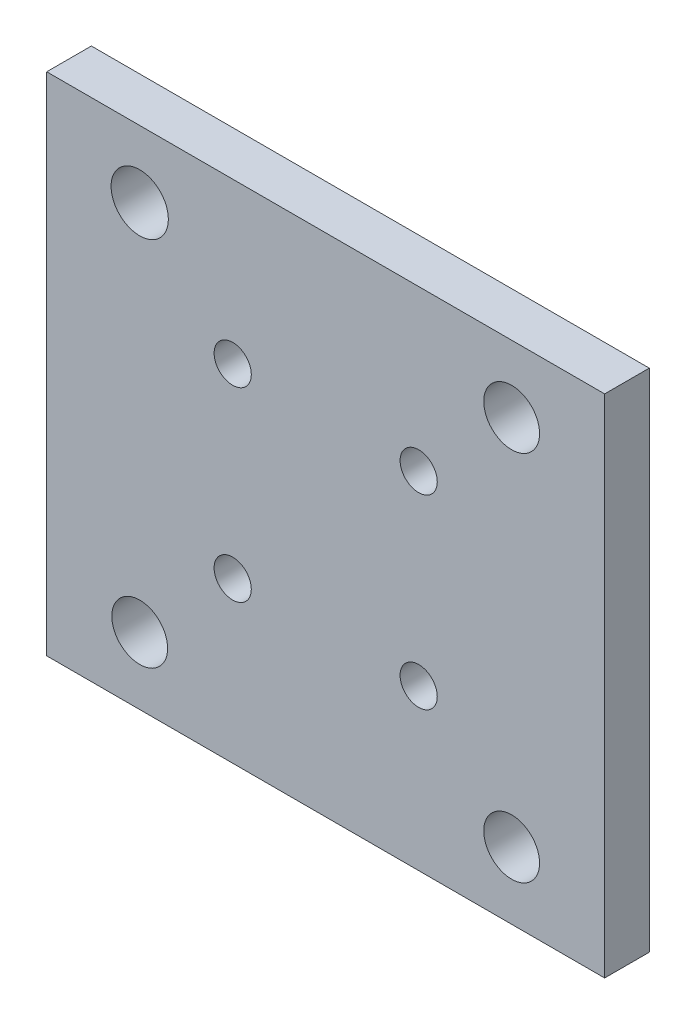
ISO-10303-21;
HEADER;
FILE_DESCRIPTION(('STEP AP214'),'2;1');
FILE_NAME('part.step','',(''),(''),'','','');
FILE_SCHEMA(('AUTOMOTIVE_DESIGN { 1 0 10303 214 1 1 1 1 }'));
ENDSEC;
DATA;
#1=APPLICATION_CONTEXT('core data for automotive mechanical design processes');
#2=APPLICATION_PROTOCOL_DEFINITION('international standard','automotive_design',2000,#1);
#3=PRODUCT_CONTEXT('',#1,'mechanical');
#4=PRODUCT('Part','Part','',(#3));
#5=PRODUCT_RELATED_PRODUCT_CATEGORY('part','',(#4));
#6=PRODUCT_DEFINITION_FORMATION('','',#4);
#7=PRODUCT_DEFINITION_CONTEXT('part definition',#1,'design');
#8=PRODUCT_DEFINITION('design','',#6,#7);
#9=PRODUCT_DEFINITION_SHAPE('','',#8);
#10=(LENGTH_UNIT() NAMED_UNIT(*) SI_UNIT(.MILLI.,.METRE.));
#11=(NAMED_UNIT(*) PLANE_ANGLE_UNIT() SI_UNIT($,.RADIAN.));
#12=(NAMED_UNIT(*) SI_UNIT($,.STERADIAN.) SOLID_ANGLE_UNIT());
#13=UNCERTAINTY_MEASURE_WITH_UNIT(LENGTH_MEASURE(1.E-05),#10,'distance_accuracy_value','');
#14=(GEOMETRIC_REPRESENTATION_CONTEXT(3) GLOBAL_UNCERTAINTY_ASSIGNED_CONTEXT((#13)) GLOBAL_UNIT_ASSIGNED_CONTEXT((#10,
#11,#12)) REPRESENTATION_CONTEXT('',''));
#15=CARTESIAN_POINT('',(0.,0.,0.));
#16=DIRECTION('',(0.,0.,1.));
#17=DIRECTION('',(1.,0.,0.));
#18=AXIS2_PLACEMENT_3D('',#15,#16,#17);
#19=CARTESIAN_POINT('',(0.,0.,6.00000000000001));
#20=DIRECTION('',(0.,0.,-1.));
#21=DIRECTION('',(-1.,0.,0.));
#22=AXIS2_PLACEMENT_3D('',#19,#20,#21);
#23=PLANE('',#22);
#24=DIRECTION('',(0.,-1.,0.));
#25=VECTOR('',#24,1.);
#26=CARTESIAN_POINT('',(0.,0.,6.00000000000001));
#27=LINE('',#26,#25);
#28=CARTESIAN_POINT('',(0.,68.,6.00000000000001));
#29=VERTEX_POINT('',#28);
#30=CARTESIAN_POINT('',(0.,0.,6.00000000000001));
#31=VERTEX_POINT('',#30);
#32=EDGE_CURVE('E91',#29,#31,#27,.T.);
#33=ORIENTED_EDGE('',*,*,#32,.T.);
#34=DIRECTION('',(1.,0.,0.));
#35=VECTOR('',#34,1.);
#36=CARTESIAN_POINT('',(0.,0.,6.00000000000001));
#37=LINE('',#36,#35);
#38=CARTESIAN_POINT('',(75.,0.,6.00000000000001));
#39=VERTEX_POINT('',#38);
#40=EDGE_CURVE('E86',#31,#39,#37,.T.);
#41=ORIENTED_EDGE('',*,*,#40,.T.);
#42=DIRECTION('',(0.,1.,0.));
#43=VECTOR('',#42,1.);
#44=CARTESIAN_POINT('',(75.,0.,6.00000000000001));
#45=LINE('',#44,#43);
#46=CARTESIAN_POINT('',(75.,68.,6.00000000000001));
#47=VERTEX_POINT('',#46);
#48=EDGE_CURVE('E89',#39,#47,#45,.T.);
#49=ORIENTED_EDGE('',*,*,#48,.T.);
#50=DIRECTION('',(-1.,0.,0.));
#51=VECTOR('',#50,1.);
#52=CARTESIAN_POINT('',(0.,68.,6.00000000000001));
#53=LINE('',#52,#51);
#54=EDGE_CURVE('E56',#47,#29,#53,.T.);
#55=ORIENTED_EDGE('',*,*,#54,.T.);
#56=EDGE_LOOP('',(#33,#41,#49,#55));
#57=FACE_BOUND('',#56,.T.);
#58=CARTESIAN_POINT('',(12.5,59.,6.00000000000001));
#59=DIRECTION('',(0.,0.,1.));
#60=DIRECTION('',(1.,0.,0.));
#61=AXIS2_PLACEMENT_3D('',#58,#59,#60);
#62=CIRCLE('',#61,3.85);
#63=CARTESIAN_POINT('',(16.35,59.,6.00000000000001));
#64=VERTEX_POINT('',#63);
#65=EDGE_CURVE('E112',#64,#64,#62,.T.);
#66=ORIENTED_EDGE('',*,*,#65,.F.);
#67=EDGE_LOOP('',(#66));
#68=FACE_BOUND('',#67,.T.);
#69=CARTESIAN_POINT('',(62.5,59.,6.00000000000001));
#70=DIRECTION('',(0.,0.,1.));
#71=DIRECTION('',(1.,0.,0.));
#72=AXIS2_PLACEMENT_3D('',#69,#70,#71);
#73=CIRCLE('',#72,3.75000000000001);
#74=CARTESIAN_POINT('',(66.25,59.,6.00000000000001));
#75=VERTEX_POINT('',#74);
#76=EDGE_CURVE('E136',#75,#75,#73,.T.);
#77=ORIENTED_EDGE('',*,*,#76,.F.);
#78=EDGE_LOOP('',(#77));
#79=FACE_BOUND('',#78,.T.);
#80=CARTESIAN_POINT('',(62.5,9.00000000000001,6.00000000000001));
#81=DIRECTION('',(0.,0.,1.));
#82=DIRECTION('',(1.,0.,0.));
#83=AXIS2_PLACEMENT_3D('',#80,#81,#82);
#84=CIRCLE('',#83,3.75000000000001);
#85=CARTESIAN_POINT('',(66.25,9.00000000000001,6.00000000000001));
#86=VERTEX_POINT('',#85);
#87=EDGE_CURVE('E144',#86,#86,#84,.T.);
#88=ORIENTED_EDGE('',*,*,#87,.F.);
#89=EDGE_LOOP('',(#88));
#90=FACE_BOUND('',#89,.T.);
#91=CARTESIAN_POINT('',(12.5,9.00000000000001,6.00000000000001));
#92=DIRECTION('',(0.,0.,1.));
#93=DIRECTION('',(1.,0.,0.));
#94=AXIS2_PLACEMENT_3D('',#91,#92,#93);
#95=CIRCLE('',#94,3.75);
#96=CARTESIAN_POINT('',(16.25,9.00000000000001,6.00000000000001));
#97=VERTEX_POINT('',#96);
#98=EDGE_CURVE('E152',#97,#97,#95,.T.);
#99=ORIENTED_EDGE('',*,*,#98,.F.);
#100=EDGE_LOOP('',(#99));
#101=FACE_BOUND('',#100,.T.);
#102=CARTESIAN_POINT('',(25.,46.5,6.00000000000001));
#103=DIRECTION('',(0.,0.,1.));
#104=DIRECTION('',(1.,0.,0.));
#105=AXIS2_PLACEMENT_3D('',#102,#103,#104);
#106=CIRCLE('',#105,2.5);
#107=CARTESIAN_POINT('',(27.5,46.5,6.00000000000001));
#108=VERTEX_POINT('',#107);
#109=EDGE_CURVE('E160',#108,#108,#106,.T.);
#110=ORIENTED_EDGE('',*,*,#109,.F.);
#111=EDGE_LOOP('',(#110));
#112=FACE_BOUND('',#111,.T.);
#113=CARTESIAN_POINT('',(50.,46.5,6.00000000000001));
#114=DIRECTION('',(0.,0.,1.));
#115=DIRECTION('',(1.,0.,0.));
#116=AXIS2_PLACEMENT_3D('',#113,#114,#115);
#117=CIRCLE('',#116,2.5);
#118=CARTESIAN_POINT('',(52.5,46.5,6.00000000000001));
#119=VERTEX_POINT('',#118);
#120=EDGE_CURVE('E168',#119,#119,#117,.T.);
#121=ORIENTED_EDGE('',*,*,#120,.F.);
#122=EDGE_LOOP('',(#121));
#123=FACE_BOUND('',#122,.T.);
#124=CARTESIAN_POINT('',(50.,21.5,6.00000000000001));
#125=DIRECTION('',(0.,0.,1.));
#126=DIRECTION('',(1.,0.,0.));
#127=AXIS2_PLACEMENT_3D('',#124,#125,#126);
#128=CIRCLE('',#127,2.5);
#129=CARTESIAN_POINT('',(52.5,21.5,6.00000000000001));
#130=VERTEX_POINT('',#129);
#131=EDGE_CURVE('E176',#130,#130,#128,.T.);
#132=ORIENTED_EDGE('',*,*,#131,.F.);
#133=EDGE_LOOP('',(#132));
#134=FACE_BOUND('',#133,.T.);
#135=CARTESIAN_POINT('',(25.,21.5,6.00000000000001));
#136=DIRECTION('',(0.,0.,1.));
#137=DIRECTION('',(1.,0.,0.));
#138=AXIS2_PLACEMENT_3D('',#135,#136,#137);
#139=CIRCLE('',#138,2.5);
#140=CARTESIAN_POINT('',(27.5,21.5,6.00000000000001));
#141=VERTEX_POINT('',#140);
#142=EDGE_CURVE('E184',#141,#141,#139,.T.);
#143=ORIENTED_EDGE('',*,*,#142,.F.);
#144=EDGE_LOOP('',(#143));
#145=FACE_BOUND('',#144,.T.);
#146=ADVANCED_FACE('F38',(#57,#68,#79,#90,#101,#112,#123,#134,#145),#23,.F.);
#147=CARTESIAN_POINT('',(0.,0.,0.));
#148=DIRECTION('',(0.,0.,-1.));
#149=DIRECTION('',(-1.,0.,0.));
#150=AXIS2_PLACEMENT_3D('',#147,#148,#149);
#151=PLANE('',#150);
#152=CARTESIAN_POINT('',(50.,21.5,0.));
#153=DIRECTION('',(0.,0.,1.));
#154=DIRECTION('',(1.,0.,0.));
#155=AXIS2_PLACEMENT_3D('',#152,#153,#154);
#156=CIRCLE('',#155,2.5);
#157=CARTESIAN_POINT('',(52.5,21.5,0.));
#158=VERTEX_POINT('',#157);
#159=EDGE_CURVE('E180',#158,#158,#156,.T.);
#160=ORIENTED_EDGE('',*,*,#159,.T.);
#161=EDGE_LOOP('',(#160));
#162=FACE_BOUND('',#161,.T.);
#163=CARTESIAN_POINT('',(25.,46.5,0.));
#164=DIRECTION('',(0.,0.,1.));
#165=DIRECTION('',(1.,0.,0.));
#166=AXIS2_PLACEMENT_3D('',#163,#164,#165);
#167=CIRCLE('',#166,2.5);
#168=CARTESIAN_POINT('',(27.5,46.5,0.));
#169=VERTEX_POINT('',#168);
#170=EDGE_CURVE('E164',#169,#169,#167,.T.);
#171=ORIENTED_EDGE('',*,*,#170,.T.);
#172=EDGE_LOOP('',(#171));
#173=FACE_BOUND('',#172,.T.);
#174=CARTESIAN_POINT('',(62.5,9.00000000000001,0.));
#175=DIRECTION('',(0.,0.,1.));
#176=DIRECTION('',(1.,0.,0.));
#177=AXIS2_PLACEMENT_3D('',#174,#175,#176);
#178=CIRCLE('',#177,3.75000000000001);
#179=CARTESIAN_POINT('',(66.25,9.00000000000001,0.));
#180=VERTEX_POINT('',#179);
#181=EDGE_CURVE('E148',#180,#180,#178,.T.);
#182=ORIENTED_EDGE('',*,*,#181,.T.);
#183=EDGE_LOOP('',(#182));
#184=FACE_BOUND('',#183,.T.);
#185=CARTESIAN_POINT('',(12.5,59.,0.));
#186=DIRECTION('',(0.,0.,1.));
#187=DIRECTION('',(1.,0.,0.));
#188=AXIS2_PLACEMENT_3D('',#185,#186,#187);
#189=CIRCLE('',#188,3.85);
#190=CARTESIAN_POINT('',(16.35,59.,0.));
#191=VERTEX_POINT('',#190);
#192=EDGE_CURVE('E132',#191,#191,#189,.T.);
#193=ORIENTED_EDGE('',*,*,#192,.T.);
#194=EDGE_LOOP('',(#193));
#195=FACE_BOUND('',#194,.T.);
#196=DIRECTION('',(0.,-1.,0.));
#197=VECTOR('',#196,1.);
#198=CARTESIAN_POINT('',(0.,0.,0.));
#199=LINE('',#198,#197);
#200=CARTESIAN_POINT('',(0.,68.,0.));
#201=VERTEX_POINT('',#200);
#202=CARTESIAN_POINT('',(0.,0.,0.));
#203=VERTEX_POINT('',#202);
#204=EDGE_CURVE('E108',#201,#203,#199,.T.);
#205=ORIENTED_EDGE('',*,*,#204,.F.);
#206=DIRECTION('',(-1.,0.,0.));
#207=VECTOR('',#206,1.);
#208=CARTESIAN_POINT('',(0.,68.,0.));
#209=LINE('',#208,#207);
#210=CARTESIAN_POINT('',(75.,68.,0.));
#211=VERTEX_POINT('',#210);
#212=EDGE_CURVE('E79',#211,#201,#209,.T.);
#213=ORIENTED_EDGE('',*,*,#212,.F.);
#214=DIRECTION('',(0.,1.,0.));
#215=VECTOR('',#214,1.);
#216=CARTESIAN_POINT('',(75.,0.,0.));
#217=LINE('',#216,#215);
#218=CARTESIAN_POINT('',(75.,0.,0.));
#219=VERTEX_POINT('',#218);
#220=EDGE_CURVE('E73',#219,#211,#217,.T.);
#221=ORIENTED_EDGE('',*,*,#220,.F.);
#222=DIRECTION('',(1.,0.,0.));
#223=VECTOR('',#222,1.);
#224=CARTESIAN_POINT('',(0.,0.,0.));
#225=LINE('',#224,#223);
#226=EDGE_CURVE('E96',#203,#219,#225,.T.);
#227=ORIENTED_EDGE('',*,*,#226,.F.);
#228=EDGE_LOOP('',(#205,#213,#221,#227));
#229=FACE_BOUND('',#228,.T.);
#230=CARTESIAN_POINT('',(62.5,59.,0.));
#231=DIRECTION('',(0.,0.,1.));
#232=DIRECTION('',(1.,0.,0.));
#233=AXIS2_PLACEMENT_3D('',#230,#231,#232);
#234=CIRCLE('',#233,3.75000000000001);
#235=CARTESIAN_POINT('',(66.25,59.,0.));
#236=VERTEX_POINT('',#235);
#237=EDGE_CURVE('E140',#236,#236,#234,.T.);
#238=ORIENTED_EDGE('',*,*,#237,.T.);
#239=EDGE_LOOP('',(#238));
#240=FACE_BOUND('',#239,.T.);
#241=CARTESIAN_POINT('',(12.5,9.00000000000001,0.));
#242=DIRECTION('',(0.,0.,1.));
#243=DIRECTION('',(1.,0.,0.));
#244=AXIS2_PLACEMENT_3D('',#241,#242,#243);
#245=CIRCLE('',#244,3.75);
#246=CARTESIAN_POINT('',(16.25,9.00000000000001,0.));
#247=VERTEX_POINT('',#246);
#248=EDGE_CURVE('E156',#247,#247,#245,.T.);
#249=ORIENTED_EDGE('',*,*,#248,.T.);
#250=EDGE_LOOP('',(#249));
#251=FACE_BOUND('',#250,.T.);
#252=CARTESIAN_POINT('',(50.,46.5,0.));
#253=DIRECTION('',(0.,0.,1.));
#254=DIRECTION('',(1.,0.,0.));
#255=AXIS2_PLACEMENT_3D('',#252,#253,#254);
#256=CIRCLE('',#255,2.5);
#257=CARTESIAN_POINT('',(52.5,46.5,0.));
#258=VERTEX_POINT('',#257);
#259=EDGE_CURVE('E172',#258,#258,#256,.T.);
#260=ORIENTED_EDGE('',*,*,#259,.T.);
#261=EDGE_LOOP('',(#260));
#262=FACE_BOUND('',#261,.T.);
#263=CARTESIAN_POINT('',(25.,21.5,0.));
#264=DIRECTION('',(0.,0.,1.));
#265=DIRECTION('',(1.,0.,0.));
#266=AXIS2_PLACEMENT_3D('',#263,#264,#265);
#267=CIRCLE('',#266,2.5);
#268=CARTESIAN_POINT('',(27.5,21.5,0.));
#269=VERTEX_POINT('',#268);
#270=EDGE_CURVE('E188',#269,#269,#267,.T.);
#271=ORIENTED_EDGE('',*,*,#270,.T.);
#272=EDGE_LOOP('',(#271));
#273=FACE_BOUND('',#272,.T.);
#274=ADVANCED_FACE('F126',(#162,#173,#184,#195,#229,#240,#251,#262,#273),#151,.T.);
#275=CARTESIAN_POINT('',(0.,0.,6.00000000000001));
#276=DIRECTION('',(1.,0.,0.));
#277=DIRECTION('',(0.,0.,-1.));
#278=AXIS2_PLACEMENT_3D('',#275,#276,#277);
#279=PLANE('',#278);
#280=ORIENTED_EDGE('',*,*,#204,.T.);
#281=DIRECTION('',(0.,0.,-1.));
#282=VECTOR('',#281,1.);
#283=CARTESIAN_POINT('',(0.,0.,6.00000000000001));
#284=LINE('',#283,#282);
#285=EDGE_CURVE('E11',#31,#203,#284,.T.);
#286=ORIENTED_EDGE('',*,*,#285,.F.);
#287=ORIENTED_EDGE('',*,*,#32,.F.);
#288=DIRECTION('',(0.,0.,-1.));
#289=VECTOR('',#288,1.);
#290=CARTESIAN_POINT('',(0.,68.,6.00000000000001));
#291=LINE('',#290,#289);
#292=EDGE_CURVE('E104',#29,#201,#291,.T.);
#293=ORIENTED_EDGE('',*,*,#292,.T.);
#294=EDGE_LOOP('',(#280,#286,#287,#293));
#295=FACE_BOUND('',#294,.T.);
#296=ADVANCED_FACE('F40',(#295),#279,.F.);
#297=CARTESIAN_POINT('',(0.,0.,6.00000000000001));
#298=DIRECTION('',(0.,1.,0.));
#299=DIRECTION('',(0.,0.,1.));
#300=AXIS2_PLACEMENT_3D('',#297,#298,#299);
#301=PLANE('',#300);
#302=ORIENTED_EDGE('',*,*,#226,.T.);
#303=DIRECTION('',(0.,0.,-1.));
#304=VECTOR('',#303,1.);
#305=CARTESIAN_POINT('',(75.,0.,6.00000000000001));
#306=LINE('',#305,#304);
#307=EDGE_CURVE('E48',#39,#219,#306,.T.);
#308=ORIENTED_EDGE('',*,*,#307,.F.);
#309=ORIENTED_EDGE('',*,*,#40,.F.);
#310=ORIENTED_EDGE('',*,*,#285,.T.);
#311=EDGE_LOOP('',(#302,#308,#309,#310));
#312=FACE_BOUND('',#311,.T.);
#313=ADVANCED_FACE('F95',(#312),#301,.F.);
#314=CARTESIAN_POINT('',(75.,0.,6.00000000000001));
#315=DIRECTION('',(-1.,0.,0.));
#316=DIRECTION('',(0.,0.,1.));
#317=AXIS2_PLACEMENT_3D('',#314,#315,#316);
#318=PLANE('',#317);
#319=ORIENTED_EDGE('',*,*,#220,.T.);
#320=DIRECTION('',(0.,0.,-1.));
#321=VECTOR('',#320,1.);
#322=CARTESIAN_POINT('',(75.,68.,6.00000000000001));
#323=LINE('',#322,#321);
#324=EDGE_CURVE('E98',#47,#211,#323,.T.);
#325=ORIENTED_EDGE('',*,*,#324,.F.);
#326=ORIENTED_EDGE('',*,*,#48,.F.);
#327=ORIENTED_EDGE('',*,*,#307,.T.);
#328=EDGE_LOOP('',(#319,#325,#326,#327));
#329=FACE_BOUND('',#328,.T.);
#330=ADVANCED_FACE('F99',(#329),#318,.F.);
#331=CARTESIAN_POINT('',(0.,68.,6.00000000000001));
#332=DIRECTION('',(0.,-1.,0.));
#333=DIRECTION('',(0.,0.,-1.));
#334=AXIS2_PLACEMENT_3D('',#331,#332,#333);
#335=PLANE('',#334);
#336=ORIENTED_EDGE('',*,*,#212,.T.);
#337=ORIENTED_EDGE('',*,*,#292,.F.);
#338=ORIENTED_EDGE('',*,*,#54,.F.);
#339=ORIENTED_EDGE('',*,*,#324,.T.);
#340=EDGE_LOOP('',(#336,#337,#338,#339));
#341=FACE_BOUND('',#340,.T.);
#342=ADVANCED_FACE('F123',(#341),#335,.F.);
#343=CARTESIAN_POINT('',(12.5,59.,6.00000000000001));
#344=DIRECTION('',(0.,0.,-1.));
#345=DIRECTION('',(-1.,0.,0.));
#346=AXIS2_PLACEMENT_3D('',#343,#344,#345);
#347=CYLINDRICAL_SURFACE('',#346,3.85);
#348=ORIENTED_EDGE('',*,*,#65,.T.);
#349=EDGE_LOOP('',(#348));
#350=FACE_BOUND('',#349,.T.);
#351=ORIENTED_EDGE('',*,*,#192,.F.);
#352=EDGE_LOOP('',(#351));
#353=FACE_BOUND('',#352,.T.);
#354=ADVANCED_FACE('F208',(#350,#353),#347,.F.);
#355=CARTESIAN_POINT('',(62.5,59.,6.00000000000001));
#356=DIRECTION('',(0.,0.,-1.));
#357=DIRECTION('',(-1.,0.,0.));
#358=AXIS2_PLACEMENT_3D('',#355,#356,#357);
#359=CYLINDRICAL_SURFACE('',#358,3.75000000000001);
#360=ORIENTED_EDGE('',*,*,#76,.T.);
#361=EDGE_LOOP('',(#360));
#362=FACE_BOUND('',#361,.T.);
#363=ORIENTED_EDGE('',*,*,#237,.F.);
#364=EDGE_LOOP('',(#363));
#365=FACE_BOUND('',#364,.T.);
#366=ADVANCED_FACE('F310',(#362,#365),#359,.F.);
#367=CARTESIAN_POINT('',(62.5,9.00000000000001,6.00000000000001));
#368=DIRECTION('',(0.,0.,-1.));
#369=DIRECTION('',(-1.,0.,0.));
#370=AXIS2_PLACEMENT_3D('',#367,#368,#369);
#371=CYLINDRICAL_SURFACE('',#370,3.75000000000001);
#372=ORIENTED_EDGE('',*,*,#87,.T.);
#373=EDGE_LOOP('',(#372));
#374=FACE_BOUND('',#373,.T.);
#375=ORIENTED_EDGE('',*,*,#181,.F.);
#376=EDGE_LOOP('',(#375));
#377=FACE_BOUND('',#376,.T.);
#378=ADVANCED_FACE('F301',(#374,#377),#371,.F.);
#379=CARTESIAN_POINT('',(12.5,9.00000000000001,6.00000000000001));
#380=DIRECTION('',(0.,0.,-1.));
#381=DIRECTION('',(-1.,0.,0.));
#382=AXIS2_PLACEMENT_3D('',#379,#380,#381);
#383=CYLINDRICAL_SURFACE('',#382,3.75);
#384=ORIENTED_EDGE('',*,*,#98,.T.);
#385=EDGE_LOOP('',(#384));
#386=FACE_BOUND('',#385,.T.);
#387=ORIENTED_EDGE('',*,*,#248,.F.);
#388=EDGE_LOOP('',(#387));
#389=FACE_BOUND('',#388,.T.);
#390=ADVANCED_FACE('F240',(#386,#389),#383,.F.);
#391=CARTESIAN_POINT('',(25.,46.5,6.00000000000001));
#392=DIRECTION('',(0.,0.,-1.));
#393=DIRECTION('',(-1.,0.,0.));
#394=AXIS2_PLACEMENT_3D('',#391,#392,#393);
#395=CYLINDRICAL_SURFACE('',#394,2.5);
#396=ORIENTED_EDGE('',*,*,#109,.T.);
#397=EDGE_LOOP('',(#396));
#398=FACE_BOUND('',#397,.T.);
#399=ORIENTED_EDGE('',*,*,#170,.F.);
#400=EDGE_LOOP('',(#399));
#401=FACE_BOUND('',#400,.T.);
#402=ADVANCED_FACE('F235',(#398,#401),#395,.F.);
#403=CARTESIAN_POINT('',(50.,46.5,6.00000000000001));
#404=DIRECTION('',(0.,0.,-1.));
#405=DIRECTION('',(-1.,0.,0.));
#406=AXIS2_PLACEMENT_3D('',#403,#404,#405);
#407=CYLINDRICAL_SURFACE('',#406,2.5);
#408=ORIENTED_EDGE('',*,*,#120,.T.);
#409=EDGE_LOOP('',(#408));
#410=FACE_BOUND('',#409,.T.);
#411=ORIENTED_EDGE('',*,*,#259,.F.);
#412=EDGE_LOOP('',(#411));
#413=FACE_BOUND('',#412,.T.);
#414=ADVANCED_FACE('F239',(#410,#413),#407,.F.);
#415=CARTESIAN_POINT('',(50.,21.5,6.00000000000001));
#416=DIRECTION('',(0.,0.,-1.));
#417=DIRECTION('',(-1.,0.,0.));
#418=AXIS2_PLACEMENT_3D('',#415,#416,#417);
#419=CYLINDRICAL_SURFACE('',#418,2.5);
#420=ORIENTED_EDGE('',*,*,#131,.T.);
#421=EDGE_LOOP('',(#420));
#422=FACE_BOUND('',#421,.T.);
#423=ORIENTED_EDGE('',*,*,#159,.F.);
#424=EDGE_LOOP('',(#423));
#425=FACE_BOUND('',#424,.T.);
#426=ADVANCED_FACE('F251',(#422,#425),#419,.F.);
#427=CARTESIAN_POINT('',(25.,21.5,6.00000000000001));
#428=DIRECTION('',(0.,0.,-1.));
#429=DIRECTION('',(-1.,0.,0.));
#430=AXIS2_PLACEMENT_3D('',#427,#428,#429);
#431=CYLINDRICAL_SURFACE('',#430,2.5);
#432=ORIENTED_EDGE('',*,*,#142,.T.);
#433=EDGE_LOOP('',(#432));
#434=FACE_BOUND('',#433,.T.);
#435=ORIENTED_EDGE('',*,*,#270,.F.);
#436=EDGE_LOOP('',(#435));
#437=FACE_BOUND('',#436,.T.);
#438=ADVANCED_FACE('F197',(#434,#437),#431,.F.);
#439=CLOSED_SHELL('',(#146,#274,#296,#313,#330,#342,#354,#366,#378,#390,#402,#414,#426,#438));
#440=MANIFOLD_SOLID_BREP('B2',#439);
#441=ADVANCED_BREP_SHAPE_REPRESENTATION('',(#18,#440),#14);
#442=SHAPE_DEFINITION_REPRESENTATION(#9,#441);
ENDSEC;
END-ISO-10303-21;
